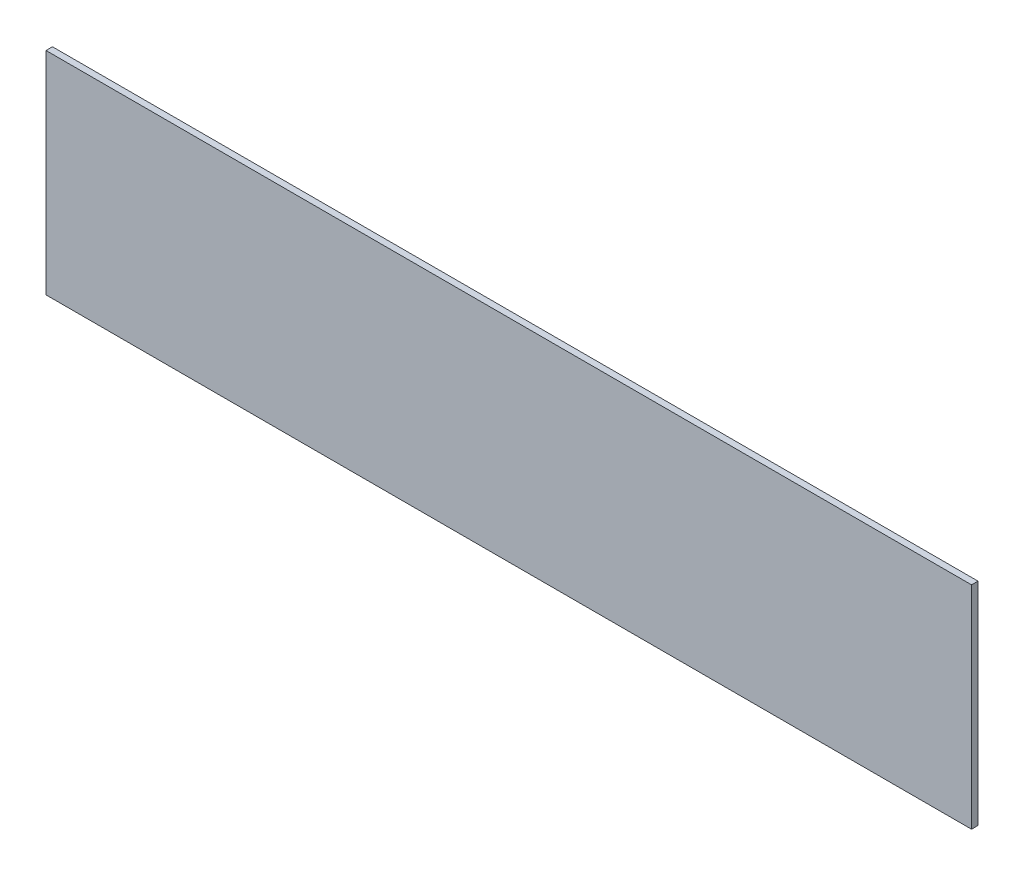
ISO-10303-21;
HEADER;
FILE_DESCRIPTION(('STEP AP214'),'2;1');
FILE_NAME('part.step','',(''),(''),'','','');
FILE_SCHEMA(('AUTOMOTIVE_DESIGN { 1 0 10303 214 1 1 1 1 }'));
ENDSEC;
DATA;
#1=APPLICATION_CONTEXT('core data for automotive mechanical design processes');
#2=APPLICATION_PROTOCOL_DEFINITION('international standard','automotive_design',2000,#1);
#3=PRODUCT_CONTEXT('',#1,'mechanical');
#4=PRODUCT('Part','Part','',(#3));
#5=PRODUCT_RELATED_PRODUCT_CATEGORY('part','',(#4));
#6=PRODUCT_DEFINITION_FORMATION('','',#4);
#7=PRODUCT_DEFINITION_CONTEXT('part definition',#1,'design');
#8=PRODUCT_DEFINITION('design','',#6,#7);
#9=PRODUCT_DEFINITION_SHAPE('','',#8);
#10=(LENGTH_UNIT() NAMED_UNIT(*) SI_UNIT(.MILLI.,.METRE.));
#11=(NAMED_UNIT(*) PLANE_ANGLE_UNIT() SI_UNIT($,.RADIAN.));
#12=(NAMED_UNIT(*) SI_UNIT($,.STERADIAN.) SOLID_ANGLE_UNIT());
#13=UNCERTAINTY_MEASURE_WITH_UNIT(LENGTH_MEASURE(1.E-05),#10,'distance_accuracy_value','');
#14=(GEOMETRIC_REPRESENTATION_CONTEXT(3) GLOBAL_UNCERTAINTY_ASSIGNED_CONTEXT((#13)) GLOBAL_UNIT_ASSIGNED_CONTEXT((#10,
#11,#12)) REPRESENTATION_CONTEXT('',''));
#15=CARTESIAN_POINT('',(0.,0.,0.));
#16=DIRECTION('',(0.,0.,1.));
#17=DIRECTION('',(1.,0.,0.));
#18=AXIS2_PLACEMENT_3D('',#15,#16,#17);
#19=CARTESIAN_POINT('',(0.,0.,18.));
#20=DIRECTION('',(1.,0.,0.));
#21=DIRECTION('',(0.,0.,-1.));
#22=AXIS2_PLACEMENT_3D('',#19,#20,#21);
#23=PLANE('',#22);
#24=DIRECTION('',(0.,-1.,0.));
#25=VECTOR('',#24,1.);
#26=CARTESIAN_POINT('',(0.,0.,0.));
#27=LINE('',#26,#25);
#28=CARTESIAN_POINT('',(0.,590.,0.));
#29=VERTEX_POINT('',#28);
#30=CARTESIAN_POINT('',(0.,0.,0.));
#31=VERTEX_POINT('',#30);
#32=EDGE_CURVE('E96',#29,#31,#27,.T.);
#33=ORIENTED_EDGE('',*,*,#32,.T.);
#34=DIRECTION('',(0.,0.,-1.));
#35=VECTOR('',#34,1.);
#36=CARTESIAN_POINT('',(0.,0.,18.));
#37=LINE('',#36,#35);
#38=CARTESIAN_POINT('',(0.,0.,18.));
#39=VERTEX_POINT('',#38);
#40=EDGE_CURVE('E11',#39,#31,#37,.T.);
#41=ORIENTED_EDGE('',*,*,#40,.F.);
#42=DIRECTION('',(0.,-1.,0.));
#43=VECTOR('',#42,1.);
#44=CARTESIAN_POINT('',(0.,0.,18.));
#45=LINE('',#44,#43);
#46=CARTESIAN_POINT('',(0.,590.,18.));
#47=VERTEX_POINT('',#46);
#48=EDGE_CURVE('E84',#47,#39,#45,.T.);
#49=ORIENTED_EDGE('',*,*,#48,.F.);
#50=DIRECTION('',(0.,0.,-1.));
#51=VECTOR('',#50,1.);
#52=CARTESIAN_POINT('',(0.,590.,18.));
#53=LINE('',#52,#51);
#54=EDGE_CURVE('E92',#47,#29,#53,.T.);
#55=ORIENTED_EDGE('',*,*,#54,.T.);
#56=EDGE_LOOP('',(#33,#41,#49,#55));
#57=FACE_BOUND('',#56,.T.);
#58=ADVANCED_FACE('F33',(#57),#23,.F.);
#59=CARTESIAN_POINT('',(0.,0.,18.));
#60=DIRECTION('',(0.,1.,0.));
#61=DIRECTION('',(0.,0.,1.));
#62=AXIS2_PLACEMENT_3D('',#59,#60,#61);
#63=PLANE('',#62);
#64=DIRECTION('',(1.,0.,0.));
#65=VECTOR('',#64,1.);
#66=CARTESIAN_POINT('',(0.,0.,0.));
#67=LINE('',#66,#65);
#68=CARTESIAN_POINT('',(2580.,0.,0.));
#69=VERTEX_POINT('',#68);
#70=EDGE_CURVE('E88',#31,#69,#67,.T.);
#71=ORIENTED_EDGE('',*,*,#70,.T.);
#72=DIRECTION('',(0.,0.,-1.));
#73=VECTOR('',#72,1.);
#74=CARTESIAN_POINT('',(2580.,0.,18.));
#75=LINE('',#74,#73);
#76=CARTESIAN_POINT('',(2580.,0.,18.));
#77=VERTEX_POINT('',#76);
#78=EDGE_CURVE('E41',#77,#69,#75,.T.);
#79=ORIENTED_EDGE('',*,*,#78,.F.);
#80=DIRECTION('',(1.,0.,0.));
#81=VECTOR('',#80,1.);
#82=CARTESIAN_POINT('',(0.,0.,18.));
#83=LINE('',#82,#81);
#84=EDGE_CURVE('E79',#39,#77,#83,.T.);
#85=ORIENTED_EDGE('',*,*,#84,.F.);
#86=ORIENTED_EDGE('',*,*,#40,.T.);
#87=EDGE_LOOP('',(#71,#79,#85,#86));
#88=FACE_BOUND('',#87,.T.);
#89=ADVANCED_FACE('F87',(#88),#63,.F.);
#90=CARTESIAN_POINT('',(2580.,0.,18.));
#91=DIRECTION('',(-1.,0.,0.));
#92=DIRECTION('',(0.,0.,1.));
#93=AXIS2_PLACEMENT_3D('',#90,#91,#92);
#94=PLANE('',#93);
#95=DIRECTION('',(0.,1.,0.));
#96=VECTOR('',#95,1.);
#97=CARTESIAN_POINT('',(2580.,0.,0.));
#98=LINE('',#97,#96);
#99=CARTESIAN_POINT('',(2580.,590.,0.));
#100=VERTEX_POINT('',#99);
#101=EDGE_CURVE('E66',#69,#100,#98,.T.);
#102=ORIENTED_EDGE('',*,*,#101,.T.);
#103=DIRECTION('',(0.,0.,-1.));
#104=VECTOR('',#103,1.);
#105=CARTESIAN_POINT('',(2580.,590.,18.));
#106=LINE('',#105,#104);
#107=CARTESIAN_POINT('',(2580.,590.,18.));
#108=VERTEX_POINT('',#107);
#109=EDGE_CURVE('E89',#108,#100,#106,.T.);
#110=ORIENTED_EDGE('',*,*,#109,.F.);
#111=DIRECTION('',(0.,1.,0.));
#112=VECTOR('',#111,1.);
#113=CARTESIAN_POINT('',(2580.,0.,18.));
#114=LINE('',#113,#112);
#115=EDGE_CURVE('E82',#77,#108,#114,.T.);
#116=ORIENTED_EDGE('',*,*,#115,.F.);
#117=ORIENTED_EDGE('',*,*,#78,.T.);
#118=EDGE_LOOP('',(#102,#110,#116,#117));
#119=FACE_BOUND('',#118,.T.);
#120=ADVANCED_FACE('F90',(#119),#94,.F.);
#121=CARTESIAN_POINT('',(0.,590.,18.));
#122=DIRECTION('',(0.,-1.,0.));
#123=DIRECTION('',(0.,0.,-1.));
#124=AXIS2_PLACEMENT_3D('',#121,#122,#123);
#125=PLANE('',#124);
#126=DIRECTION('',(-1.,0.,0.));
#127=VECTOR('',#126,1.);
#128=CARTESIAN_POINT('',(0.,590.,0.));
#129=LINE('',#128,#127);
#130=EDGE_CURVE('E72',#100,#29,#129,.T.);
#131=ORIENTED_EDGE('',*,*,#130,.T.);
#132=ORIENTED_EDGE('',*,*,#54,.F.);
#133=DIRECTION('',(-1.,0.,0.));
#134=VECTOR('',#133,1.);
#135=CARTESIAN_POINT('',(0.,590.,18.));
#136=LINE('',#135,#134);
#137=EDGE_CURVE('E49',#108,#47,#136,.T.);
#138=ORIENTED_EDGE('',*,*,#137,.F.);
#139=ORIENTED_EDGE('',*,*,#109,.T.);
#140=EDGE_LOOP('',(#131,#132,#138,#139));
#141=FACE_BOUND('',#140,.T.);
#142=ADVANCED_FACE('F103',(#141),#125,.F.);
#143=CARTESIAN_POINT('',(0.,0.,18.));
#144=DIRECTION('',(0.,0.,-1.));
#145=DIRECTION('',(-1.,0.,0.));
#146=AXIS2_PLACEMENT_3D('',#143,#144,#145);
#147=PLANE('',#146);
#148=ORIENTED_EDGE('',*,*,#48,.T.);
#149=ORIENTED_EDGE('',*,*,#84,.T.);
#150=ORIENTED_EDGE('',*,*,#115,.T.);
#151=ORIENTED_EDGE('',*,*,#137,.T.);
#152=EDGE_LOOP('',(#148,#149,#150,#151));
#153=FACE_BOUND('',#152,.T.);
#154=ADVANCED_FACE('F80',(#153),#147,.F.);
#155=CARTESIAN_POINT('',(0.,0.,0.));
#156=DIRECTION('',(0.,0.,-1.));
#157=DIRECTION('',(-1.,0.,0.));
#158=AXIS2_PLACEMENT_3D('',#155,#156,#157);
#159=PLANE('',#158);
#160=ORIENTED_EDGE('',*,*,#32,.F.);
#161=ORIENTED_EDGE('',*,*,#130,.F.);
#162=ORIENTED_EDGE('',*,*,#101,.F.);
#163=ORIENTED_EDGE('',*,*,#70,.F.);
#164=EDGE_LOOP('',(#160,#161,#162,#163));
#165=FACE_BOUND('',#164,.T.);
#166=ADVANCED_FACE('F106',(#165),#159,.T.);
#167=CLOSED_SHELL('',(#58,#89,#120,#142,#154,#166));
#168=MANIFOLD_SOLID_BREP('B2',#167);
#169=ADVANCED_BREP_SHAPE_REPRESENTATION('',(#18,#168),#14);
#170=SHAPE_DEFINITION_REPRESENTATION(#9,#169);
ENDSEC;
END-ISO-10303-21;
